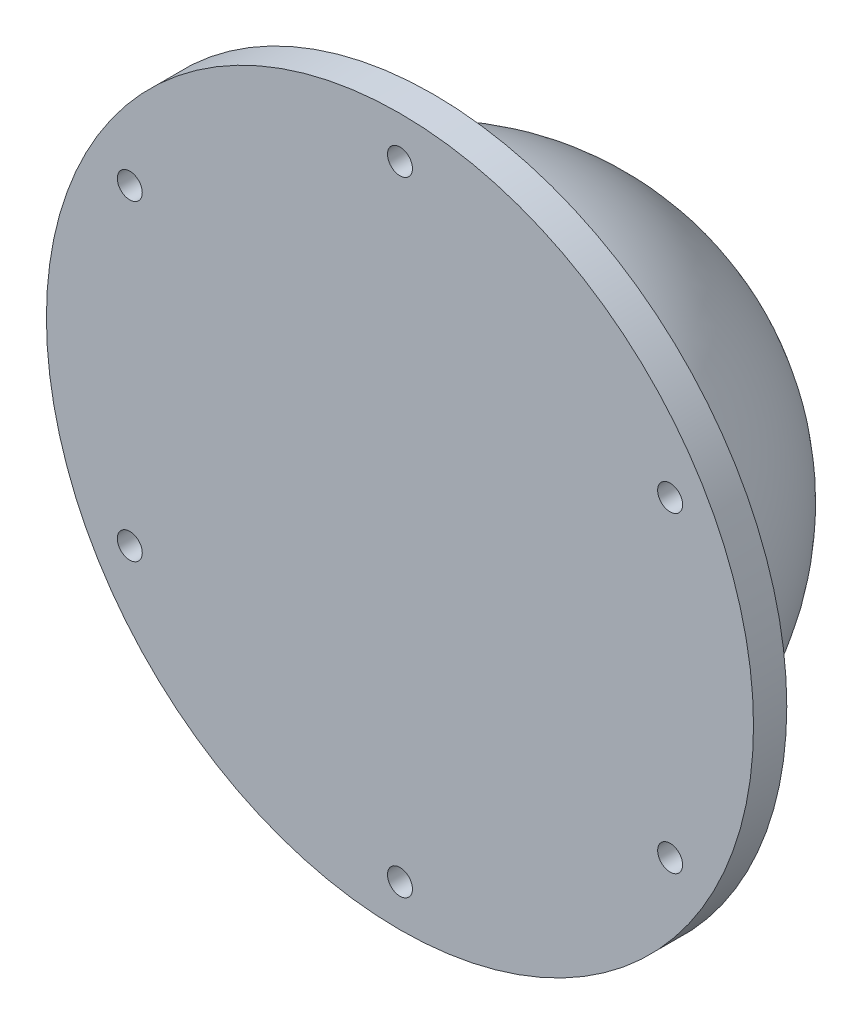
ISO-10303-21;
HEADER;
FILE_DESCRIPTION(('STEP AP214'),'2;1');
FILE_NAME('part.step','',(''),(''),'','','');
FILE_SCHEMA(('AUTOMOTIVE_DESIGN { 1 0 10303 214 1 1 1 1 }'));
ENDSEC;
DATA;
#1=APPLICATION_CONTEXT('core data for automotive mechanical design processes');
#2=APPLICATION_PROTOCOL_DEFINITION('international standard','automotive_design',2000,#1);
#3=PRODUCT_CONTEXT('',#1,'mechanical');
#4=PRODUCT('Part','Part','',(#3));
#5=PRODUCT_RELATED_PRODUCT_CATEGORY('part','',(#4));
#6=PRODUCT_DEFINITION_FORMATION('','',#4);
#7=PRODUCT_DEFINITION_CONTEXT('part definition',#1,'design');
#8=PRODUCT_DEFINITION('design','',#6,#7);
#9=PRODUCT_DEFINITION_SHAPE('','',#8);
#10=(LENGTH_UNIT() NAMED_UNIT(*) SI_UNIT(.MILLI.,.METRE.));
#11=(NAMED_UNIT(*) PLANE_ANGLE_UNIT() SI_UNIT($,.RADIAN.));
#12=(NAMED_UNIT(*) SI_UNIT($,.STERADIAN.) SOLID_ANGLE_UNIT());
#13=UNCERTAINTY_MEASURE_WITH_UNIT(LENGTH_MEASURE(1.E-05),#10,'distance_accuracy_value','');
#14=(GEOMETRIC_REPRESENTATION_CONTEXT(3) GLOBAL_UNCERTAINTY_ASSIGNED_CONTEXT((#13)) GLOBAL_UNIT_ASSIGNED_CONTEXT((#10,
#11,#12)) REPRESENTATION_CONTEXT('',''));
#15=CARTESIAN_POINT('',(0.,0.,0.));
#16=DIRECTION('',(0.,0.,1.));
#17=DIRECTION('',(1.,0.,0.));
#18=AXIS2_PLACEMENT_3D('',#15,#16,#17);
#19=CARTESIAN_POINT('',(0.,0.,8.));
#20=DIRECTION('',(0.,0.,1.));
#21=DIRECTION('',(1.,0.,0.));
#22=AXIS2_PLACEMENT_3D('',#19,#20,#21);
#23=PLANE('',#22);
#24=CARTESIAN_POINT('',(-64.9519052838284,-37.5000000000026,8.));
#25=DIRECTION('',(0.,0.,1.));
#26=DIRECTION('',(1.,0.,0.));
#27=AXIS2_PLACEMENT_3D('',#24,#25,#26);
#28=CIRCLE('',#27,3.);
#29=CARTESIAN_POINT('',(-61.9519052838284,-37.5000000000026,8.));
#30=VERTEX_POINT('',#29);
#31=EDGE_CURVE('E83',#30,#30,#28,.T.);
#32=ORIENTED_EDGE('',*,*,#31,.F.);
#33=EDGE_LOOP('',(#32));
#34=FACE_BOUND('',#33,.T.);
#35=CARTESIAN_POINT('',(64.9519052838374,-37.4999999999974,8.));
#36=DIRECTION('',(0.,0.,1.));
#37=DIRECTION('',(1.,0.,0.));
#38=AXIS2_PLACEMENT_3D('',#35,#36,#37);
#39=CIRCLE('',#38,3.00000000000001);
#40=CARTESIAN_POINT('',(67.9519052838374,-37.4999999999974,8.));
#41=VERTEX_POINT('',#40);
#42=EDGE_CURVE('E71',#41,#41,#39,.T.);
#43=ORIENTED_EDGE('',*,*,#42,.F.);
#44=EDGE_LOOP('',(#43));
#45=FACE_BOUND('',#44,.T.);
#46=CARTESIAN_POINT('',(0.,75.,8.));
#47=DIRECTION('',(0.,0.,1.));
#48=DIRECTION('',(1.,0.,0.));
#49=AXIS2_PLACEMENT_3D('',#46,#47,#48);
#50=CIRCLE('',#49,3.);
#51=CARTESIAN_POINT('',(3.,75.,8.));
#52=VERTEX_POINT('',#51);
#53=EDGE_CURVE('E60',#52,#52,#50,.T.);
#54=ORIENTED_EDGE('',*,*,#53,.F.);
#55=EDGE_LOOP('',(#54));
#56=FACE_BOUND('',#55,.T.);
#57=CARTESIAN_POINT('',(0.,0.,8.));
#58=DIRECTION('',(0.,0.,1.));
#59=DIRECTION('',(1.,0.,0.));
#60=AXIS2_PLACEMENT_3D('',#57,#58,#59);
#61=CIRCLE('',#60,85.);
#62=CARTESIAN_POINT('',(85.,0.,8.));
#63=VERTEX_POINT('',#62);
#64=EDGE_CURVE('E52',#63,#63,#61,.T.);
#65=ORIENTED_EDGE('',*,*,#64,.T.);
#66=EDGE_LOOP('',(#65));
#67=FACE_BOUND('',#66,.T.);
#68=CARTESIAN_POINT('',(64.9519052838344,37.5000000000026,8.));
#69=DIRECTION('',(0.,0.,1.));
#70=DIRECTION('',(1.,0.,0.));
#71=AXIS2_PLACEMENT_3D('',#68,#69,#70);
#72=CIRCLE('',#71,3.00000000000001);
#73=CARTESIAN_POINT('',(67.9519052838344,37.5000000000026,8.));
#74=VERTEX_POINT('',#73);
#75=EDGE_CURVE('E65',#74,#74,#72,.T.);
#76=ORIENTED_EDGE('',*,*,#75,.F.);
#77=EDGE_LOOP('',(#76));
#78=FACE_BOUND('',#77,.T.);
#79=CARTESIAN_POINT('',(5.94345372100232E-12,-75.,8.));
#80=DIRECTION('',(0.,0.,1.));
#81=DIRECTION('',(1.,0.,0.));
#82=AXIS2_PLACEMENT_3D('',#79,#80,#81);
#83=CIRCLE('',#82,3.);
#84=CARTESIAN_POINT('',(3.00000000000594,-75.,8.));
#85=VERTEX_POINT('',#84);
#86=EDGE_CURVE('E77',#85,#85,#83,.T.);
#87=ORIENTED_EDGE('',*,*,#86,.F.);
#88=EDGE_LOOP('',(#87));
#89=FACE_BOUND('',#88,.T.);
#90=CARTESIAN_POINT('',(-64.9519052838315,37.4999999999974,8.));
#91=DIRECTION('',(0.,0.,1.));
#92=DIRECTION('',(1.,0.,0.));
#93=AXIS2_PLACEMENT_3D('',#90,#91,#92);
#94=CIRCLE('',#93,3.);
#95=CARTESIAN_POINT('',(-61.9519052838314,37.4999999999974,8.));
#96=VERTEX_POINT('',#95);
#97=EDGE_CURVE('E89',#96,#96,#94,.T.);
#98=ORIENTED_EDGE('',*,*,#97,.F.);
#99=EDGE_LOOP('',(#98));
#100=FACE_BOUND('',#99,.T.);
#101=ADVANCED_FACE('F40',(#34,#45,#56,#67,#78,#89,#100),#23,.T.);
#102=CARTESIAN_POINT('',(0.,0.,0.));
#103=DIRECTION('',(0.,0.,1.));
#104=DIRECTION('',(1.,0.,0.));
#105=AXIS2_PLACEMENT_3D('',#102,#103,#104);
#106=PLANE('',#105);
#107=CARTESIAN_POINT('',(0.,0.,0.));
#108=DIRECTION('',(0.,0.,1.));
#109=DIRECTION('',(1.,0.,0.));
#110=AXIS2_PLACEMENT_3D('',#107,#108,#109);
#111=CIRCLE('',#110,65.);
#112=CARTESIAN_POINT('',(65.,0.,0.));
#113=VERTEX_POINT('',#112);
#114=EDGE_CURVE('E48',#113,#113,#111,.F.);
#115=ORIENTED_EDGE('',*,*,#114,.F.);
#116=EDGE_LOOP('',(#115));
#117=FACE_BOUND('',#116,.T.);
#118=CARTESIAN_POINT('',(0.,0.,0.));
#119=DIRECTION('',(0.,0.,1.));
#120=DIRECTION('',(1.,0.,0.));
#121=AXIS2_PLACEMENT_3D('',#118,#119,#120);
#122=CIRCLE('',#121,85.);
#123=CARTESIAN_POINT('',(85.,0.,0.));
#124=VERTEX_POINT('',#123);
#125=EDGE_CURVE('E56',#124,#124,#122,.T.);
#126=ORIENTED_EDGE('',*,*,#125,.F.);
#127=EDGE_LOOP('',(#126));
#128=FACE_BOUND('',#127,.T.);
#129=CARTESIAN_POINT('',(0.,75.,0.));
#130=DIRECTION('',(0.,0.,1.));
#131=DIRECTION('',(1.,0.,0.));
#132=AXIS2_PLACEMENT_3D('',#129,#130,#131);
#133=CIRCLE('',#132,3.);
#134=CARTESIAN_POINT('',(3.,75.,0.));
#135=VERTEX_POINT('',#134);
#136=EDGE_CURVE('E62',#135,#135,#133,.T.);
#137=ORIENTED_EDGE('',*,*,#136,.T.);
#138=EDGE_LOOP('',(#137));
#139=FACE_BOUND('',#138,.T.);
#140=CARTESIAN_POINT('',(64.9519052838344,37.5000000000026,0.));
#141=DIRECTION('',(0.,0.,1.));
#142=DIRECTION('',(1.,0.,0.));
#143=AXIS2_PLACEMENT_3D('',#140,#141,#142);
#144=CIRCLE('',#143,3.00000000000001);
#145=CARTESIAN_POINT('',(67.9519052838344,37.5000000000026,0.));
#146=VERTEX_POINT('',#145);
#147=EDGE_CURVE('E68',#146,#146,#144,.T.);
#148=ORIENTED_EDGE('',*,*,#147,.T.);
#149=EDGE_LOOP('',(#148));
#150=FACE_BOUND('',#149,.T.);
#151=CARTESIAN_POINT('',(64.9519052838374,-37.4999999999974,0.));
#152=DIRECTION('',(0.,0.,1.));
#153=DIRECTION('',(1.,0.,0.));
#154=AXIS2_PLACEMENT_3D('',#151,#152,#153);
#155=CIRCLE('',#154,3.00000000000001);
#156=CARTESIAN_POINT('',(67.9519052838374,-37.4999999999974,0.));
#157=VERTEX_POINT('',#156);
#158=EDGE_CURVE('E74',#157,#157,#155,.T.);
#159=ORIENTED_EDGE('',*,*,#158,.T.);
#160=EDGE_LOOP('',(#159));
#161=FACE_BOUND('',#160,.T.);
#162=CARTESIAN_POINT('',(5.94345372100232E-12,-75.,0.));
#163=DIRECTION('',(0.,0.,1.));
#164=DIRECTION('',(1.,0.,0.));
#165=AXIS2_PLACEMENT_3D('',#162,#163,#164);
#166=CIRCLE('',#165,3.);
#167=CARTESIAN_POINT('',(3.00000000000594,-75.,0.));
#168=VERTEX_POINT('',#167);
#169=EDGE_CURVE('E80',#168,#168,#166,.T.);
#170=ORIENTED_EDGE('',*,*,#169,.T.);
#171=EDGE_LOOP('',(#170));
#172=FACE_BOUND('',#171,.T.);
#173=CARTESIAN_POINT('',(-64.9519052838284,-37.5000000000026,0.));
#174=DIRECTION('',(0.,0.,1.));
#175=DIRECTION('',(1.,0.,0.));
#176=AXIS2_PLACEMENT_3D('',#173,#174,#175);
#177=CIRCLE('',#176,3.);
#178=CARTESIAN_POINT('',(-61.9519052838284,-37.5000000000026,0.));
#179=VERTEX_POINT('',#178);
#180=EDGE_CURVE('E86',#179,#179,#177,.T.);
#181=ORIENTED_EDGE('',*,*,#180,.T.);
#182=EDGE_LOOP('',(#181));
#183=FACE_BOUND('',#182,.T.);
#184=CARTESIAN_POINT('',(-64.9519052838315,37.4999999999974,0.));
#185=DIRECTION('',(0.,0.,1.));
#186=DIRECTION('',(1.,0.,0.));
#187=AXIS2_PLACEMENT_3D('',#184,#185,#186);
#188=CIRCLE('',#187,3.);
#189=CARTESIAN_POINT('',(-61.9519052838314,37.4999999999974,0.));
#190=VERTEX_POINT('',#189);
#191=EDGE_CURVE('E92',#190,#190,#188,.T.);
#192=ORIENTED_EDGE('',*,*,#191,.T.);
#193=EDGE_LOOP('',(#192));
#194=FACE_BOUND('',#193,.T.);
#195=ADVANCED_FACE('F102',(#117,#128,#139,#150,#161,#172,#183,#194),#106,.F.);
#196=CARTESIAN_POINT('',(0.,0.,8.));
#197=DIRECTION('',(0.,0.,-1.));
#198=DIRECTION('',(-1.,0.,0.));
#199=AXIS2_PLACEMENT_3D('',#196,#197,#198);
#200=CYLINDRICAL_SURFACE('',#199,85.);
#201=ORIENTED_EDGE('',*,*,#64,.F.);
#202=EDGE_LOOP('',(#201));
#203=FACE_BOUND('',#202,.T.);
#204=ORIENTED_EDGE('',*,*,#125,.T.);
#205=EDGE_LOOP('',(#204));
#206=FACE_BOUND('',#205,.T.);
#207=ADVANCED_FACE('F42',(#203,#206),#200,.T.);
#208=CARTESIAN_POINT('',(0.,75.,8.));
#209=DIRECTION('',(0.,0.,-1.));
#210=DIRECTION('',(-1.,0.,0.));
#211=AXIS2_PLACEMENT_3D('',#208,#209,#210);
#212=CYLINDRICAL_SURFACE('',#211,3.);
#213=ORIENTED_EDGE('',*,*,#53,.T.);
#214=EDGE_LOOP('',(#213));
#215=FACE_BOUND('',#214,.T.);
#216=ORIENTED_EDGE('',*,*,#136,.F.);
#217=EDGE_LOOP('',(#216));
#218=FACE_BOUND('',#217,.T.);
#219=ADVANCED_FACE('F114',(#215,#218),#212,.F.);
#220=CARTESIAN_POINT('',(64.9519052838344,37.5000000000026,8.));
#221=DIRECTION('',(0.,0.,-1.));
#222=DIRECTION('',(-1.,0.,0.));
#223=AXIS2_PLACEMENT_3D('',#220,#221,#222);
#224=CYLINDRICAL_SURFACE('',#223,3.00000000000001);
#225=ORIENTED_EDGE('',*,*,#75,.T.);
#226=EDGE_LOOP('',(#225));
#227=FACE_BOUND('',#226,.T.);
#228=ORIENTED_EDGE('',*,*,#147,.F.);
#229=EDGE_LOOP('',(#228));
#230=FACE_BOUND('',#229,.T.);
#231=ADVANCED_FACE('F117',(#227,#230),#224,.F.);
#232=CARTESIAN_POINT('',(64.9519052838374,-37.4999999999974,8.));
#233=DIRECTION('',(0.,0.,-1.));
#234=DIRECTION('',(-1.,0.,0.));
#235=AXIS2_PLACEMENT_3D('',#232,#233,#234);
#236=CYLINDRICAL_SURFACE('',#235,3.00000000000001);
#237=ORIENTED_EDGE('',*,*,#42,.T.);
#238=EDGE_LOOP('',(#237));
#239=FACE_BOUND('',#238,.T.);
#240=ORIENTED_EDGE('',*,*,#158,.F.);
#241=EDGE_LOOP('',(#240));
#242=FACE_BOUND('',#241,.T.);
#243=ADVANCED_FACE('F121',(#239,#242),#236,.F.);
#244=CARTESIAN_POINT('',(5.94345372100232E-12,-75.,8.));
#245=DIRECTION('',(0.,0.,-1.));
#246=DIRECTION('',(-1.,0.,0.));
#247=AXIS2_PLACEMENT_3D('',#244,#245,#246);
#248=CYLINDRICAL_SURFACE('',#247,3.);
#249=ORIENTED_EDGE('',*,*,#86,.T.);
#250=EDGE_LOOP('',(#249));
#251=FACE_BOUND('',#250,.T.);
#252=ORIENTED_EDGE('',*,*,#169,.F.);
#253=EDGE_LOOP('',(#252));
#254=FACE_BOUND('',#253,.T.);
#255=ADVANCED_FACE('F125',(#251,#254),#248,.F.);
#256=CARTESIAN_POINT('',(-64.9519052838284,-37.5000000000026,8.));
#257=DIRECTION('',(0.,0.,-1.));
#258=DIRECTION('',(-1.,0.,0.));
#259=AXIS2_PLACEMENT_3D('',#256,#257,#258);
#260=CYLINDRICAL_SURFACE('',#259,3.);
#261=ORIENTED_EDGE('',*,*,#31,.T.);
#262=EDGE_LOOP('',(#261));
#263=FACE_BOUND('',#262,.T.);
#264=ORIENTED_EDGE('',*,*,#180,.F.);
#265=EDGE_LOOP('',(#264));
#266=FACE_BOUND('',#265,.T.);
#267=ADVANCED_FACE('F129',(#263,#266),#260,.F.);
#268=CARTESIAN_POINT('',(-64.9519052838315,37.4999999999974,8.));
#269=DIRECTION('',(0.,0.,-1.));
#270=DIRECTION('',(-1.,0.,0.));
#271=AXIS2_PLACEMENT_3D('',#268,#269,#270);
#272=CYLINDRICAL_SURFACE('',#271,3.);
#273=ORIENTED_EDGE('',*,*,#97,.T.);
#274=EDGE_LOOP('',(#273));
#275=FACE_BOUND('',#274,.T.);
#276=ORIENTED_EDGE('',*,*,#191,.F.);
#277=EDGE_LOOP('',(#276));
#278=FACE_BOUND('',#277,.T.);
#279=ADVANCED_FACE('F98',(#275,#278),#272,.F.);
#280=CARTESIAN_POINT('',(0.,0.,0.));
#281=DIRECTION('',(0.,0.,1.));
#282=DIRECTION('',(1.,0.,0.));
#283=AXIS2_PLACEMENT_3D('',#280,#281,#282);
#284=SPHERICAL_SURFACE('',#283,65.);
#285=ORIENTED_EDGE('',*,*,#114,.T.);
#286=EDGE_LOOP('',(#285));
#287=FACE_BOUND('',#286,.T.);
#288=ADVANCED_FACE('F136',(#287),#284,.T.);
#289=CLOSED_SHELL('',(#101,#195,#207,#219,#231,#243,#255,#267,#279,#288));
#290=CARTESIAN_POINT('',(0.,0.,0.));
#291=DIRECTION('',(0.,0.,1.));
#292=DIRECTION('',(-1.,0.,0.));
#293=AXIS2_PLACEMENT_3D('',#290,#291,#292);
#294=SPHERICAL_SURFACE('',#293,60.);
#295=CARTESIAN_POINT('',(0.,0.,0.));
#296=DIRECTION('',(0.,0.,1.));
#297=DIRECTION('',(1.,0.,0.));
#298=AXIS2_PLACEMENT_3D('',#295,#296,#297);
#299=CIRCLE('',#298,60.);
#300=CARTESIAN_POINT('',(60.,0.,0.));
#301=VERTEX_POINT('',#300);
#302=EDGE_CURVE('E10',#301,#301,#299,.T.);
#303=ORIENTED_EDGE('',*,*,#302,.T.);
#304=EDGE_LOOP('',(#303));
#305=FACE_BOUND('',#304,.T.);
#306=ADVANCED_FACE('F137',(#305),#294,.F.);
#307=ORIENTED_EDGE('',*,*,#302,.F.);
#308=EDGE_LOOP('',(#307));
#309=FACE_BOUND('',#308,.T.);
#310=ADVANCED_FACE('F110',(#309),#106,.F.);
#311=CLOSED_SHELL('',(#306,#310));
#312=ORIENTED_CLOSED_SHELL('',*,#311,.T.);
#313=BREP_WITH_VOIDS('B2',#289,(#312));
#314=ADVANCED_BREP_SHAPE_REPRESENTATION('',(#18,#313),#14);
#315=SHAPE_DEFINITION_REPRESENTATION(#9,#314);
ENDSEC;
END-ISO-10303-21;
